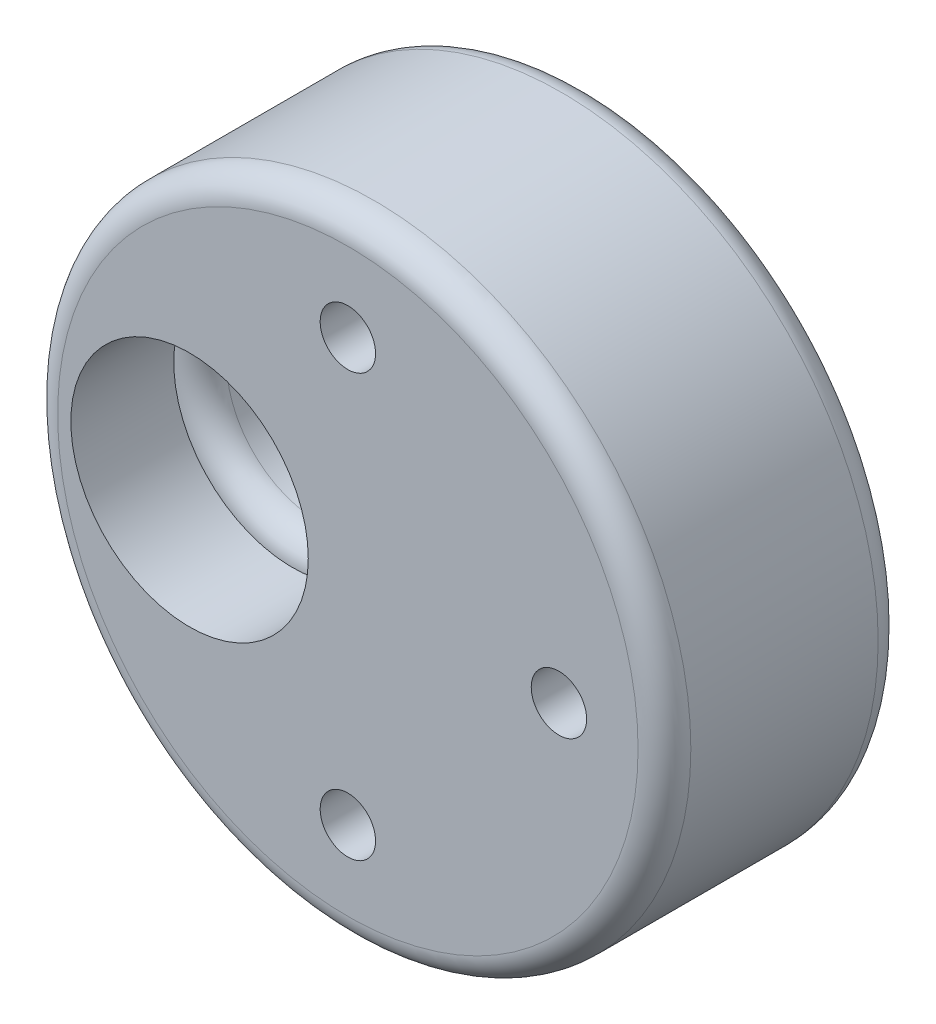
ISO-10303-21;
HEADER;
FILE_DESCRIPTION(('STEP AP214'),'2;1');
FILE_NAME('part.step','',(''),(''),'','','');
FILE_SCHEMA(('AUTOMOTIVE_DESIGN { 1 0 10303 214 1 1 1 1 }'));
ENDSEC;
DATA;
#1=APPLICATION_CONTEXT('core data for automotive mechanical design processes');
#2=APPLICATION_PROTOCOL_DEFINITION('international standard','automotive_design',2000,#1);
#3=PRODUCT_CONTEXT('',#1,'mechanical');
#4=PRODUCT('Part','Part','',(#3));
#5=PRODUCT_RELATED_PRODUCT_CATEGORY('part','',(#4));
#6=PRODUCT_DEFINITION_FORMATION('','',#4);
#7=PRODUCT_DEFINITION_CONTEXT('part definition',#1,'design');
#8=PRODUCT_DEFINITION('design','',#6,#7);
#9=PRODUCT_DEFINITION_SHAPE('','',#8);
#10=(LENGTH_UNIT() NAMED_UNIT(*) SI_UNIT(.MILLI.,.METRE.));
#11=(NAMED_UNIT(*) PLANE_ANGLE_UNIT() SI_UNIT($,.RADIAN.));
#12=(NAMED_UNIT(*) SI_UNIT($,.STERADIAN.) SOLID_ANGLE_UNIT());
#13=UNCERTAINTY_MEASURE_WITH_UNIT(LENGTH_MEASURE(1.E-05),#10,'distance_accuracy_value','');
#14=(GEOMETRIC_REPRESENTATION_CONTEXT(3) GLOBAL_UNCERTAINTY_ASSIGNED_CONTEXT((#13)) GLOBAL_UNIT_ASSIGNED_CONTEXT((#10,
#11,#12)) REPRESENTATION_CONTEXT('',''));
#15=CARTESIAN_POINT('',(0.,0.,0.));
#16=DIRECTION('',(0.,0.,1.));
#17=DIRECTION('',(1.,0.,0.));
#18=AXIS2_PLACEMENT_3D('',#15,#16,#17);
#19=CARTESIAN_POINT('',(8.00000000000028,1.62077717745761E-13,9.1));
#20=DIRECTION('',(0.,0.,-1.));
#21=DIRECTION('',(-1.,0.,0.));
#22=AXIS2_PLACEMENT_3D('',#19,#20,#21);
#23=CYLINDRICAL_SURFACE('',#22,1.0500000000001);
#24=CARTESIAN_POINT('',(8.00000000000028,1.62077717745761E-13,9.1));
#25=DIRECTION('',(0.,0.,1.));
#26=DIRECTION('',(1.,0.,0.));
#27=AXIS2_PLACEMENT_3D('',#24,#25,#26);
#28=CIRCLE('',#27,1.0500000000001);
#29=CARTESIAN_POINT('',(9.05000000000038,1.62077717745761E-13,9.1));
#30=VERTEX_POINT('',#29);
#31=EDGE_CURVE('E77',#30,#30,#28,.T.);
#32=ORIENTED_EDGE('',*,*,#31,.T.);
#33=EDGE_LOOP('',(#32));
#34=FACE_BOUND('',#33,.T.);
#35=CARTESIAN_POINT('',(8.00000000000028,1.62077717745761E-13,6.2));
#36=DIRECTION('',(0.,0.,-1.));
#37=DIRECTION('',(-1.,0.,0.));
#38=AXIS2_PLACEMENT_3D('',#35,#36,#37);
#39=CIRCLE('',#38,1.0500000000001);
#40=CARTESIAN_POINT('',(6.95000000000018,1.62077717745761E-13,6.2));
#41=VERTEX_POINT('',#40);
#42=EDGE_CURVE('E60',#41,#41,#39,.T.);
#43=ORIENTED_EDGE('',*,*,#42,.T.);
#44=EDGE_LOOP('',(#43));
#45=FACE_BOUND('',#44,.T.);
#46=ADVANCED_FACE('F30',(#34,#45),#23,.F.);
#47=CARTESIAN_POINT('',(3.24155435491522E-13,-8.,9.1));
#48=DIRECTION('',(0.,0.,-1.));
#49=DIRECTION('',(-1.,0.,0.));
#50=AXIS2_PLACEMENT_3D('',#47,#48,#49);
#51=CYLINDRICAL_SURFACE('',#50,1.05000000000036);
#52=CARTESIAN_POINT('',(3.24155435491522E-13,-8.,9.1));
#53=DIRECTION('',(0.,0.,1.));
#54=DIRECTION('',(1.,0.,0.));
#55=AXIS2_PLACEMENT_3D('',#52,#53,#54);
#56=CIRCLE('',#55,1.05000000000036);
#57=CARTESIAN_POINT('',(1.05000000000069,-8.,9.1));
#58=VERTEX_POINT('',#57);
#59=EDGE_CURVE('E80',#58,#58,#56,.T.);
#60=ORIENTED_EDGE('',*,*,#59,.T.);
#61=EDGE_LOOP('',(#60));
#62=FACE_BOUND('',#61,.T.);
#63=CARTESIAN_POINT('',(3.24155435491522E-13,-8.,6.2));
#64=DIRECTION('',(0.,0.,-1.));
#65=DIRECTION('',(-1.,0.,0.));
#66=AXIS2_PLACEMENT_3D('',#63,#64,#65);
#67=CIRCLE('',#66,1.05000000000036);
#68=CARTESIAN_POINT('',(-1.05000000000004,-8.,6.2));
#69=VERTEX_POINT('',#68);
#70=EDGE_CURVE('E65',#69,#69,#67,.T.);
#71=ORIENTED_EDGE('',*,*,#70,.T.);
#72=EDGE_LOOP('',(#71));
#73=FACE_BOUND('',#72,.T.);
#74=ADVANCED_FACE('F139',(#62,#73),#51,.F.);
#75=CARTESIAN_POINT('',(0.,8.,9.1));
#76=DIRECTION('',(0.,0.,-1.));
#77=DIRECTION('',(-1.,0.,0.));
#78=AXIS2_PLACEMENT_3D('',#75,#76,#77);
#79=CYLINDRICAL_SURFACE('',#78,1.05);
#80=CARTESIAN_POINT('',(0.,8.,9.1));
#81=DIRECTION('',(0.,0.,1.));
#82=DIRECTION('',(1.,0.,0.));
#83=AXIS2_PLACEMENT_3D('',#80,#81,#82);
#84=CIRCLE('',#83,1.05);
#85=CARTESIAN_POINT('',(1.05,8.,9.1));
#86=VERTEX_POINT('',#85);
#87=EDGE_CURVE('E59',#86,#86,#84,.T.);
#88=ORIENTED_EDGE('',*,*,#87,.T.);
#89=EDGE_LOOP('',(#88));
#90=FACE_BOUND('',#89,.T.);
#91=CARTESIAN_POINT('',(0.,8.,6.2));
#92=DIRECTION('',(0.,0.,-1.));
#93=DIRECTION('',(-1.,0.,0.));
#94=AXIS2_PLACEMENT_3D('',#91,#92,#93);
#95=CIRCLE('',#94,1.05);
#96=CARTESIAN_POINT('',(-1.05,8.,6.2));
#97=VERTEX_POINT('',#96);
#98=EDGE_CURVE('E70',#97,#97,#95,.T.);
#99=ORIENTED_EDGE('',*,*,#98,.T.);
#100=EDGE_LOOP('',(#99));
#101=FACE_BOUND('',#100,.T.);
#102=ADVANCED_FACE('F145',(#90,#101),#79,.F.);
#103=CARTESIAN_POINT('',(0.,0.,9.1));
#104=DIRECTION('',(0.,0.,1.));
#105=DIRECTION('',(1.,0.,0.));
#106=AXIS2_PLACEMENT_3D('',#103,#104,#105);
#107=PLANE('',#106);
#108=CARTESIAN_POINT('',(0.,0.,9.1));
#109=DIRECTION('',(0.,0.,1.));
#110=DIRECTION('',(1.,0.,0.));
#111=AXIS2_PLACEMENT_3D('',#108,#109,#110);
#112=CIRCLE('',#111,11.);
#113=CARTESIAN_POINT('',(11.,0.,9.1));
#114=VERTEX_POINT('',#113);
#115=EDGE_CURVE('E50',#114,#114,#112,.T.);
#116=ORIENTED_EDGE('',*,*,#115,.T.);
#117=EDGE_LOOP('',(#116));
#118=FACE_BOUND('',#117,.T.);
#119=CARTESIAN_POINT('',(-6.,0.,9.1));
#120=DIRECTION('',(0.,0.,1.));
#121=DIRECTION('',(1.,0.,0.));
#122=AXIS2_PLACEMENT_3D('',#119,#120,#121);
#123=CIRCLE('',#122,4.50000000000001);
#124=CARTESIAN_POINT('',(-1.49999999999999,0.,9.1));
#125=VERTEX_POINT('',#124);
#126=EDGE_CURVE('E73',#125,#125,#123,.T.);
#127=ORIENTED_EDGE('',*,*,#126,.F.);
#128=EDGE_LOOP('',(#127));
#129=FACE_BOUND('',#128,.T.);
#130=ORIENTED_EDGE('',*,*,#31,.F.);
#131=EDGE_LOOP('',(#130));
#132=FACE_BOUND('',#131,.T.);
#133=ORIENTED_EDGE('',*,*,#87,.F.);
#134=EDGE_LOOP('',(#133));
#135=FACE_BOUND('',#134,.T.);
#136=ORIENTED_EDGE('',*,*,#59,.F.);
#137=EDGE_LOOP('',(#136));
#138=FACE_BOUND('',#137,.T.);
#139=ADVANCED_FACE('F115',(#118,#129,#132,#135,#138),#107,.T.);
#140=CARTESIAN_POINT('',(0.,0.,0.));
#141=DIRECTION('',(0.,0.,1.));
#142=DIRECTION('',(1.,0.,0.));
#143=AXIS2_PLACEMENT_3D('',#140,#141,#142);
#144=PLANE('',#143);
#145=CARTESIAN_POINT('',(0.,0.,0.));
#146=DIRECTION('',(0.,0.,1.));
#147=DIRECTION('',(1.,0.,0.));
#148=AXIS2_PLACEMENT_3D('',#145,#146,#147);
#149=CIRCLE('',#148,11.);
#150=CARTESIAN_POINT('',(11.,0.,0.));
#151=VERTEX_POINT('',#150);
#152=EDGE_CURVE('E10',#151,#151,#149,.F.);
#153=ORIENTED_EDGE('',*,*,#152,.T.);
#154=EDGE_LOOP('',(#153));
#155=FACE_BOUND('',#154,.T.);
#156=CARTESIAN_POINT('',(-6.,0.,0.));
#157=DIRECTION('',(0.,0.,1.));
#158=DIRECTION('',(1.,0.,0.));
#159=AXIS2_PLACEMENT_3D('',#156,#157,#158);
#160=CIRCLE('',#159,4.50000000000001);
#161=CARTESIAN_POINT('',(-1.49999999999999,0.,0.));
#162=VERTEX_POINT('',#161);
#163=EDGE_CURVE('E37',#162,#162,#160,.T.);
#164=ORIENTED_EDGE('',*,*,#163,.T.);
#165=EDGE_LOOP('',(#164));
#166=FACE_BOUND('',#165,.T.);
#167=CARTESIAN_POINT('',(8.00000000000028,1.62077717745761E-13,0.));
#168=DIRECTION('',(0.,0.,-1.));
#169=DIRECTION('',(-1.,0.,0.));
#170=AXIS2_PLACEMENT_3D('',#167,#168,#169);
#171=CIRCLE('',#170,2.15);
#172=CARTESIAN_POINT('',(5.85000000000028,1.62077717745761E-13,0.));
#173=VERTEX_POINT('',#172);
#174=EDGE_CURVE('E96',#173,#173,#171,.T.);
#175=ORIENTED_EDGE('',*,*,#174,.F.);
#176=EDGE_LOOP('',(#175));
#177=FACE_BOUND('',#176,.T.);
#178=CARTESIAN_POINT('',(3.24155435491522E-13,-8.,0.));
#179=DIRECTION('',(0.,0.,-1.));
#180=DIRECTION('',(-1.,0.,0.));
#181=AXIS2_PLACEMENT_3D('',#178,#179,#180);
#182=CIRCLE('',#181,2.15);
#183=CARTESIAN_POINT('',(-2.14999999999968,-8.,0.));
#184=VERTEX_POINT('',#183);
#185=EDGE_CURVE('E63',#184,#184,#182,.T.);
#186=ORIENTED_EDGE('',*,*,#185,.F.);
#187=EDGE_LOOP('',(#186));
#188=FACE_BOUND('',#187,.T.);
#189=CARTESIAN_POINT('',(0.,8.,0.));
#190=DIRECTION('',(0.,0.,-1.));
#191=DIRECTION('',(-1.,0.,0.));
#192=AXIS2_PLACEMENT_3D('',#189,#190,#191);
#193=CIRCLE('',#192,2.15);
#194=CARTESIAN_POINT('',(-2.15,8.,0.));
#195=VERTEX_POINT('',#194);
#196=EDGE_CURVE('E68',#195,#195,#193,.T.);
#197=ORIENTED_EDGE('',*,*,#196,.F.);
#198=EDGE_LOOP('',(#197));
#199=FACE_BOUND('',#198,.T.);
#200=ADVANCED_FACE('F111',(#155,#166,#177,#188,#199),#144,.F.);
#201=CARTESIAN_POINT('',(0.,0.,9.1));
#202=DIRECTION('',(0.,0.,-1.));
#203=DIRECTION('',(-1.,0.,0.));
#204=AXIS2_PLACEMENT_3D('',#201,#202,#203);
#205=CYLINDRICAL_SURFACE('',#204,12.);
#206=CARTESIAN_POINT('',(0.,0.,8.1));
#207=DIRECTION('',(0.,0.,1.));
#208=DIRECTION('',(1.,0.,0.));
#209=AXIS2_PLACEMENT_3D('',#206,#207,#208);
#210=CIRCLE('',#209,12.);
#211=CARTESIAN_POINT('',(12.,0.,8.1));
#212=VERTEX_POINT('',#211);
#213=EDGE_CURVE('E41',#212,#212,#210,.F.);
#214=ORIENTED_EDGE('',*,*,#213,.T.);
#215=EDGE_LOOP('',(#214));
#216=FACE_BOUND('',#215,.T.);
#217=CARTESIAN_POINT('',(0.,0.,1.));
#218=DIRECTION('',(0.,0.,1.));
#219=DIRECTION('',(1.,0.,0.));
#220=AXIS2_PLACEMENT_3D('',#217,#218,#219);
#221=CIRCLE('',#220,12.);
#222=CARTESIAN_POINT('',(12.,0.,1.));
#223=VERTEX_POINT('',#222);
#224=EDGE_CURVE('E45',#223,#223,#221,.T.);
#225=ORIENTED_EDGE('',*,*,#224,.T.);
#226=EDGE_LOOP('',(#225));
#227=FACE_BOUND('',#226,.T.);
#228=ADVANCED_FACE('F114',(#216,#227),#205,.T.);
#229=CARTESIAN_POINT('',(-6.,0.,9.1));
#230=DIRECTION('',(0.,0.,1.));
#231=DIRECTION('',(1.,0.,0.));
#232=AXIS2_PLACEMENT_3D('',#229,#230,#231);
#233=CYLINDRICAL_SURFACE('',#232,3.50000000000001);
#234=CARTESIAN_POINT('',(-6.,0.,4.2));
#235=DIRECTION('',(0.,0.,-1.));
#236=DIRECTION('',(-1.,0.,0.));
#237=AXIS2_PLACEMENT_3D('',#234,#235,#236);
#238=CIRCLE('',#237,3.50000000000001);
#239=CARTESIAN_POINT('',(-9.50000000000001,0.,4.2));
#240=VERTEX_POINT('',#239);
#241=EDGE_CURVE('E53',#240,#240,#238,.F.);
#242=ORIENTED_EDGE('',*,*,#241,.T.);
#243=EDGE_LOOP('',(#242));
#244=FACE_BOUND('',#243,.T.);
#245=CARTESIAN_POINT('',(-6.,0.,1.));
#246=DIRECTION('',(0.,0.,1.));
#247=DIRECTION('',(1.,0.,0.));
#248=AXIS2_PLACEMENT_3D('',#245,#246,#247);
#249=CIRCLE('',#248,3.50000000000001);
#250=CARTESIAN_POINT('',(-2.49999999999999,0.,1.));
#251=VERTEX_POINT('',#250);
#252=EDGE_CURVE('E56',#251,#251,#249,.F.);
#253=ORIENTED_EDGE('',*,*,#252,.T.);
#254=EDGE_LOOP('',(#253));
#255=FACE_BOUND('',#254,.T.);
#256=ADVANCED_FACE('F134',(#244,#255),#233,.F.);
#257=CARTESIAN_POINT('',(-6.,0.,9.1));
#258=DIRECTION('',(0.,0.,1.));
#259=DIRECTION('',(1.,0.,0.));
#260=AXIS2_PLACEMENT_3D('',#257,#258,#259);
#261=CYLINDRICAL_SURFACE('',#260,4.50000000000001);
#262=CARTESIAN_POINT('',(-6.,0.,5.2));
#263=DIRECTION('',(0.,0.,1.));
#264=DIRECTION('',(1.,0.,0.));
#265=AXIS2_PLACEMENT_3D('',#262,#263,#264);
#266=CIRCLE('',#265,4.50000000000001);
#267=CARTESIAN_POINT('',(-1.49999999999999,0.,5.2));
#268=VERTEX_POINT('',#267);
#269=EDGE_CURVE('E83',#268,#268,#266,.T.);
#270=ORIENTED_EDGE('',*,*,#269,.F.);
#271=EDGE_LOOP('',(#270));
#272=FACE_BOUND('',#271,.T.);
#273=ORIENTED_EDGE('',*,*,#126,.T.);
#274=EDGE_LOOP('',(#273));
#275=FACE_BOUND('',#274,.T.);
#276=ADVANCED_FACE('F124',(#272,#275),#261,.F.);
#277=CARTESIAN_POINT('',(0.,8.,6.2));
#278=DIRECTION('',(0.,0.,-1.));
#279=DIRECTION('',(-1.,0.,0.));
#280=AXIS2_PLACEMENT_3D('',#277,#278,#279);
#281=CYLINDRICAL_SURFACE('',#280,2.15);
#282=CARTESIAN_POINT('',(0.,8.,6.2));
#283=DIRECTION('',(0.,0.,-1.));
#284=DIRECTION('',(-1.,0.,0.));
#285=AXIS2_PLACEMENT_3D('',#282,#283,#284);
#286=CIRCLE('',#285,2.15);
#287=CARTESIAN_POINT('',(-2.15,8.,6.2));
#288=VERTEX_POINT('',#287);
#289=EDGE_CURVE('E74',#288,#288,#286,.T.);
#290=CARTESIAN_POINT('',(-2.15,8.,6.2));
#291=CARTESIAN_POINT('',(-2.15,8.,6.13541666666667));
#292=CARTESIAN_POINT('',(-2.15,8.,6.07083333333333));
#293=CARTESIAN_POINT('',(-2.15,8.,5.94166666666667));
#294=CARTESIAN_POINT('',(-2.15,8.,5.87708333333333));
#295=CARTESIAN_POINT('',(-2.15,8.,5.74791666666667));
#296=CARTESIAN_POINT('',(-2.15,8.,5.68333333333333));
#297=CARTESIAN_POINT('',(-2.15,8.,5.55416666666667));
#298=CARTESIAN_POINT('',(-2.15,8.,5.48958333333333));
#299=CARTESIAN_POINT('',(-2.15,8.,5.36041666666667));
#300=CARTESIAN_POINT('',(-2.15,8.,5.29583333333333));
#301=CARTESIAN_POINT('',(-2.15,8.,5.16666666666667));
#302=CARTESIAN_POINT('',(-2.15,8.,5.10208333333333));
#303=CARTESIAN_POINT('',(-2.15,8.,4.97291666666667));
#304=CARTESIAN_POINT('',(-2.15,8.,4.90833333333333));
#305=CARTESIAN_POINT('',(-2.15,8.,4.77916666666667));
#306=CARTESIAN_POINT('',(-2.15,8.,4.71458333333333));
#307=CARTESIAN_POINT('',(-2.15,8.,4.58541666666667));
#308=CARTESIAN_POINT('',(-2.15,8.,4.52083333333333));
#309=CARTESIAN_POINT('',(-2.15,8.,4.39166666666667));
#310=CARTESIAN_POINT('',(-2.15,8.,4.32708333333333));
#311=CARTESIAN_POINT('',(-2.15,8.,4.19791666666667));
#312=CARTESIAN_POINT('',(-2.15,8.,4.13333333333333));
#313=CARTESIAN_POINT('',(-2.15,8.,4.00416666666667));
#314=CARTESIAN_POINT('',(-2.15,8.,3.93958333333333));
#315=CARTESIAN_POINT('',(-2.15,8.,3.81041666666667));
#316=CARTESIAN_POINT('',(-2.15,8.,3.74583333333333));
#317=CARTESIAN_POINT('',(-2.15,8.,3.61666666666667));
#318=CARTESIAN_POINT('',(-2.15,8.,3.55208333333333));
#319=CARTESIAN_POINT('',(-2.15,8.,3.42291666666667));
#320=CARTESIAN_POINT('',(-2.15,8.,3.35833333333333));
#321=CARTESIAN_POINT('',(-2.15,8.,3.22916666666667));
#322=CARTESIAN_POINT('',(-2.15,8.,3.16458333333333));
#323=CARTESIAN_POINT('',(-2.15,8.,3.03541666666667));
#324=CARTESIAN_POINT('',(-2.15,8.,2.97083333333333));
#325=CARTESIAN_POINT('',(-2.15,8.,2.84166666666667));
#326=CARTESIAN_POINT('',(-2.15,8.,2.77708333333333));
#327=CARTESIAN_POINT('',(-2.15,8.,2.64791666666667));
#328=CARTESIAN_POINT('',(-2.15,8.,2.58333333333333));
#329=CARTESIAN_POINT('',(-2.15,8.,2.45416666666667));
#330=CARTESIAN_POINT('',(-2.15,8.,2.38958333333333));
#331=CARTESIAN_POINT('',(-2.15,8.,2.26041666666667));
#332=CARTESIAN_POINT('',(-2.15,8.,2.19583333333333));
#333=CARTESIAN_POINT('',(-2.15,8.,2.06666666666667));
#334=CARTESIAN_POINT('',(-2.15,8.,2.00208333333333));
#335=CARTESIAN_POINT('',(-2.15,8.,1.87291666666667));
#336=CARTESIAN_POINT('',(-2.15,8.,1.80833333333333));
#337=CARTESIAN_POINT('',(-2.15,8.,1.67916666666667));
#338=CARTESIAN_POINT('',(-2.15,8.,1.61458333333333));
#339=CARTESIAN_POINT('',(-2.15,8.,1.48541666666667));
#340=CARTESIAN_POINT('',(-2.15,8.,1.42083333333333));
#341=CARTESIAN_POINT('',(-2.15,8.,1.29166666666667));
#342=CARTESIAN_POINT('',(-2.15,8.,1.22708333333333));
#343=CARTESIAN_POINT('',(-2.15,8.,1.09791666666667));
#344=CARTESIAN_POINT('',(-2.15,8.,1.03333333333333));
#345=CARTESIAN_POINT('',(-2.15,8.,0.904166666666667));
#346=CARTESIAN_POINT('',(-2.15,8.,0.839583333333333));
#347=CARTESIAN_POINT('',(-2.15,8.,0.710416666666666));
#348=CARTESIAN_POINT('',(-2.15,8.,0.645833333333333));
#349=CARTESIAN_POINT('',(-2.15,8.,0.516666666666667));
#350=CARTESIAN_POINT('',(-2.15,8.,0.452083333333333));
#351=CARTESIAN_POINT('',(-2.15,8.,0.322916666666667));
#352=CARTESIAN_POINT('',(-2.15,8.,0.258333333333334));
#353=CARTESIAN_POINT('',(-2.15,8.,0.129166666666667));
#354=CARTESIAN_POINT('',(-2.15,8.,0.0645833333333335));
#355=CARTESIAN_POINT('',(-2.15,8.,0.));
#356=B_SPLINE_CURVE_WITH_KNOTS('',3,(#290,#291,#292,#293,#294,#295,#296,#297,#298,#299,#300,
#301,#302,#303,#304,#305,#306,#307,#308,#309,#310,#311,#312,#313,#314,#315,#316,#317,#318,#319,
#320,#321,#322,#323,#324,#325,#326,#327,#328,#329,#330,#331,#332,#333,#334,#335,#336,#337,#338,
#339,#340,#341,#342,#343,#344,#345,#346,#347,#348,#349,#350,#351,#352,#353,#354,#355),
.UNSPECIFIED.,.F.,.F.,(4,2,2,2,2,2,2,2,2,2,2,2,2,2,2,2,2,2,2,2,2,2,2,2,2,2,2,2,2,2,2,2,4),(0.,
0.193749999999999,0.3875,0.581249999999999,0.775,0.96875,1.1625,1.35625,1.55,1.74375,1.9375,
2.13125,2.325,2.51875,2.7125,2.90625,3.1,3.29375,3.4875,3.68125,3.875,4.06875,4.2625,4.45625,
4.65,4.84375,5.0375,5.23125,5.425,5.61875,5.8125,6.00625,6.2),.UNSPECIFIED.);
#357=EDGE_CURVE('BSEAM121',#288,#195,#356,.T.);
#358=ORIENTED_EDGE('',*,*,#289,.F.);
#359=ORIENTED_EDGE('',*,*,#196,.T.);
#360=ORIENTED_EDGE('',*,*,#357,.T.);
#361=ORIENTED_EDGE('',*,*,#357,.F.);
#362=EDGE_LOOP('',(#358,#360,#359,#361));
#363=FACE_BOUND('',#362,.T.);
#364=ADVANCED_FACE('F121',(#363),#281,.F.);
#365=CARTESIAN_POINT('',(0.,8.,6.2));
#366=DIRECTION('',(0.,0.,-1.));
#367=DIRECTION('',(-1.,0.,0.));
#368=AXIS2_PLACEMENT_3D('',#365,#366,#367);
#369=PLANE('',#368);
#370=ORIENTED_EDGE('',*,*,#98,.F.);
#371=EDGE_LOOP('',(#370));
#372=FACE_BOUND('',#371,.T.);
#373=ORIENTED_EDGE('',*,*,#289,.T.);
#374=EDGE_LOOP('',(#373));
#375=FACE_BOUND('',#374,.T.);
#376=ADVANCED_FACE('F123',(#372,#375),#369,.T.);
#377=CARTESIAN_POINT('',(3.24155435491522E-13,-8.,6.2));
#378=DIRECTION('',(0.,0.,-1.));
#379=DIRECTION('',(-1.,0.,0.));
#380=AXIS2_PLACEMENT_3D('',#377,#378,#379);
#381=CYLINDRICAL_SURFACE('',#380,2.15);
#382=CARTESIAN_POINT('',(3.24155435491522E-13,-8.,6.2));
#383=DIRECTION('',(0.,0.,-1.));
#384=DIRECTION('',(-1.,0.,0.));
#385=AXIS2_PLACEMENT_3D('',#382,#383,#384);
#386=CIRCLE('',#385,2.15);
#387=CARTESIAN_POINT('',(-2.14999999999968,-8.,6.2));
#388=VERTEX_POINT('',#387);
#389=EDGE_CURVE('E69',#388,#388,#386,.T.);
#390=CARTESIAN_POINT('',(-2.14999999999968,-8.,6.2));
#391=CARTESIAN_POINT('',(-2.14999999999968,-8.,6.13541666666667));
#392=CARTESIAN_POINT('',(-2.14999999999968,-8.,6.07083333333333));
#393=CARTESIAN_POINT('',(-2.14999999999968,-8.,5.94166666666667));
#394=CARTESIAN_POINT('',(-2.14999999999968,-8.,5.87708333333333));
#395=CARTESIAN_POINT('',(-2.14999999999968,-8.,5.74791666666667));
#396=CARTESIAN_POINT('',(-2.14999999999968,-8.,5.68333333333333));
#397=CARTESIAN_POINT('',(-2.14999999999968,-8.,5.55416666666667));
#398=CARTESIAN_POINT('',(-2.14999999999968,-8.,5.48958333333333));
#399=CARTESIAN_POINT('',(-2.14999999999968,-8.,5.36041666666667));
#400=CARTESIAN_POINT('',(-2.14999999999968,-8.,5.29583333333333));
#401=CARTESIAN_POINT('',(-2.14999999999968,-8.,5.16666666666667));
#402=CARTESIAN_POINT('',(-2.14999999999968,-8.,5.10208333333333));
#403=CARTESIAN_POINT('',(-2.14999999999968,-8.,4.97291666666667));
#404=CARTESIAN_POINT('',(-2.14999999999968,-8.,4.90833333333333));
#405=CARTESIAN_POINT('',(-2.14999999999968,-8.,4.77916666666667));
#406=CARTESIAN_POINT('',(-2.14999999999968,-8.,4.71458333333333));
#407=CARTESIAN_POINT('',(-2.14999999999968,-8.,4.58541666666667));
#408=CARTESIAN_POINT('',(-2.14999999999968,-8.,4.52083333333333));
#409=CARTESIAN_POINT('',(-2.14999999999968,-8.,4.39166666666667));
#410=CARTESIAN_POINT('',(-2.14999999999968,-8.,4.32708333333333));
#411=CARTESIAN_POINT('',(-2.14999999999968,-8.,4.19791666666667));
#412=CARTESIAN_POINT('',(-2.14999999999968,-8.,4.13333333333333));
#413=CARTESIAN_POINT('',(-2.14999999999968,-8.,4.00416666666667));
#414=CARTESIAN_POINT('',(-2.14999999999968,-8.,3.93958333333333));
#415=CARTESIAN_POINT('',(-2.14999999999968,-8.,3.81041666666667));
#416=CARTESIAN_POINT('',(-2.14999999999968,-8.,3.74583333333333));
#417=CARTESIAN_POINT('',(-2.14999999999968,-8.,3.61666666666667));
#418=CARTESIAN_POINT('',(-2.14999999999968,-8.,3.55208333333333));
#419=CARTESIAN_POINT('',(-2.14999999999968,-8.,3.42291666666667));
#420=CARTESIAN_POINT('',(-2.14999999999968,-8.,3.35833333333333));
#421=CARTESIAN_POINT('',(-2.14999999999968,-8.,3.22916666666667));
#422=CARTESIAN_POINT('',(-2.14999999999968,-8.,3.16458333333333));
#423=CARTESIAN_POINT('',(-2.14999999999968,-8.,3.03541666666667));
#424=CARTESIAN_POINT('',(-2.14999999999968,-8.,2.97083333333333));
#425=CARTESIAN_POINT('',(-2.14999999999968,-8.,2.84166666666667));
#426=CARTESIAN_POINT('',(-2.14999999999968,-8.,2.77708333333333));
#427=CARTESIAN_POINT('',(-2.14999999999968,-8.,2.64791666666667));
#428=CARTESIAN_POINT('',(-2.14999999999968,-8.,2.58333333333333));
#429=CARTESIAN_POINT('',(-2.14999999999968,-8.,2.45416666666667));
#430=CARTESIAN_POINT('',(-2.14999999999968,-8.,2.38958333333333));
#431=CARTESIAN_POINT('',(-2.14999999999968,-8.,2.26041666666667));
#432=CARTESIAN_POINT('',(-2.14999999999968,-8.,2.19583333333333));
#433=CARTESIAN_POINT('',(-2.14999999999968,-8.,2.06666666666667));
#434=CARTESIAN_POINT('',(-2.14999999999968,-8.,2.00208333333333));
#435=CARTESIAN_POINT('',(-2.14999999999968,-8.,1.87291666666667));
#436=CARTESIAN_POINT('',(-2.14999999999968,-8.,1.80833333333333));
#437=CARTESIAN_POINT('',(-2.14999999999968,-8.,1.67916666666667));
#438=CARTESIAN_POINT('',(-2.14999999999968,-8.,1.61458333333333));
#439=CARTESIAN_POINT('',(-2.14999999999968,-8.,1.48541666666667));
#440=CARTESIAN_POINT('',(-2.14999999999968,-8.,1.42083333333333));
#441=CARTESIAN_POINT('',(-2.14999999999968,-8.,1.29166666666667));
#442=CARTESIAN_POINT('',(-2.14999999999968,-8.,1.22708333333333));
#443=CARTESIAN_POINT('',(-2.14999999999968,-8.,1.09791666666667));
#444=CARTESIAN_POINT('',(-2.14999999999968,-8.,1.03333333333333));
#445=CARTESIAN_POINT('',(-2.14999999999968,-8.,0.904166666666667));
#446=CARTESIAN_POINT('',(-2.14999999999968,-8.,0.839583333333333));
#447=CARTESIAN_POINT('',(-2.14999999999968,-8.,0.710416666666666));
#448=CARTESIAN_POINT('',(-2.14999999999968,-8.,0.645833333333333));
#449=CARTESIAN_POINT('',(-2.14999999999968,-8.,0.516666666666667));
#450=CARTESIAN_POINT('',(-2.14999999999968,-8.,0.452083333333333));
#451=CARTESIAN_POINT('',(-2.14999999999968,-8.,0.322916666666667));
#452=CARTESIAN_POINT('',(-2.14999999999968,-8.,0.258333333333334));
#453=CARTESIAN_POINT('',(-2.14999999999968,-8.,0.129166666666667));
#454=CARTESIAN_POINT('',(-2.14999999999968,-8.,0.0645833333333335));
#455=CARTESIAN_POINT('',(-2.14999999999968,-8.,0.));
#456=B_SPLINE_CURVE_WITH_KNOTS('',3,(#390,#391,#392,#393,#394,#395,#396,#397,#398,#399,#400,
#401,#402,#403,#404,#405,#406,#407,#408,#409,#410,#411,#412,#413,#414,#415,#416,#417,#418,#419,
#420,#421,#422,#423,#424,#425,#426,#427,#428,#429,#430,#431,#432,#433,#434,#435,#436,#437,#438,
#439,#440,#441,#442,#443,#444,#445,#446,#447,#448,#449,#450,#451,#452,#453,#454,#455),
.UNSPECIFIED.,.F.,.F.,(4,2,2,2,2,2,2,2,2,2,2,2,2,2,2,2,2,2,2,2,2,2,2,2,2,2,2,2,2,2,2,2,4),(0.,
0.193749999999999,0.3875,0.581249999999999,0.775,0.96875,1.1625,1.35625,1.55,1.74375,1.9375,
2.13125,2.325,2.51875,2.7125,2.90625,3.1,3.29375,3.4875,3.68125,3.875,4.06875,4.2625,4.45625,
4.65,4.84375,5.0375,5.23125,5.425,5.61875,5.8125,6.00625,6.2),.UNSPECIFIED.);
#457=EDGE_CURVE('BSEAM131',#388,#184,#456,.T.);
#458=ORIENTED_EDGE('',*,*,#389,.F.);
#459=ORIENTED_EDGE('',*,*,#185,.T.);
#460=ORIENTED_EDGE('',*,*,#457,.T.);
#461=ORIENTED_EDGE('',*,*,#457,.F.);
#462=EDGE_LOOP('',(#458,#460,#459,#461));
#463=FACE_BOUND('',#462,.T.);
#464=ADVANCED_FACE('F131',(#463),#381,.F.);
#465=CARTESIAN_POINT('',(3.24155435491522E-13,-8.,6.2));
#466=DIRECTION('',(0.,0.,-1.));
#467=DIRECTION('',(-1.,0.,0.));
#468=AXIS2_PLACEMENT_3D('',#465,#466,#467);
#469=PLANE('',#468);
#470=ORIENTED_EDGE('',*,*,#70,.F.);
#471=EDGE_LOOP('',(#470));
#472=FACE_BOUND('',#471,.T.);
#473=ORIENTED_EDGE('',*,*,#389,.T.);
#474=EDGE_LOOP('',(#473));
#475=FACE_BOUND('',#474,.T.);
#476=ADVANCED_FACE('F107',(#472,#475),#469,.T.);
#477=CARTESIAN_POINT('',(8.00000000000028,1.62077717745761E-13,6.2));
#478=DIRECTION('',(0.,0.,-1.));
#479=DIRECTION('',(-1.,0.,0.));
#480=AXIS2_PLACEMENT_3D('',#477,#478,#479);
#481=CYLINDRICAL_SURFACE('',#480,2.15);
#482=CARTESIAN_POINT('',(8.00000000000028,1.62077717745761E-13,6.2));
#483=DIRECTION('',(0.,0.,-1.));
#484=DIRECTION('',(-1.,0.,0.));
#485=AXIS2_PLACEMENT_3D('',#482,#483,#484);
#486=CIRCLE('',#485,2.15);
#487=CARTESIAN_POINT('',(5.85000000000028,1.62077717745761E-13,6.2));
#488=VERTEX_POINT('',#487);
#489=EDGE_CURVE('E64',#488,#488,#486,.T.);
#490=CARTESIAN_POINT('',(5.85000000000028,1.62077717745761E-13,6.2));
#491=CARTESIAN_POINT('',(5.85000000000028,1.62077717745761E-13,6.13541666666667));
#492=CARTESIAN_POINT('',(5.85000000000028,1.62077717745761E-13,6.07083333333333));
#493=CARTESIAN_POINT('',(5.85000000000028,1.62077717745761E-13,5.94166666666667));
#494=CARTESIAN_POINT('',(5.85000000000028,1.62077717745761E-13,5.87708333333333));
#495=CARTESIAN_POINT('',(5.85000000000028,1.62077717745761E-13,5.74791666666667));
#496=CARTESIAN_POINT('',(5.85000000000028,1.62077717745761E-13,5.68333333333333));
#497=CARTESIAN_POINT('',(5.85000000000028,1.62077717745761E-13,5.55416666666667));
#498=CARTESIAN_POINT('',(5.85000000000028,1.62077717745761E-13,5.48958333333333));
#499=CARTESIAN_POINT('',(5.85000000000028,1.62077717745761E-13,5.36041666666667));
#500=CARTESIAN_POINT('',(5.85000000000028,1.62077717745761E-13,5.29583333333333));
#501=CARTESIAN_POINT('',(5.85000000000028,1.62077717745761E-13,5.16666666666667));
#502=CARTESIAN_POINT('',(5.85000000000028,1.62077717745761E-13,5.10208333333333));
#503=CARTESIAN_POINT('',(5.85000000000028,1.62077717745761E-13,4.97291666666667));
#504=CARTESIAN_POINT('',(5.85000000000028,1.62077717745761E-13,4.90833333333333));
#505=CARTESIAN_POINT('',(5.85000000000028,1.62077717745761E-13,4.77916666666667));
#506=CARTESIAN_POINT('',(5.85000000000028,1.62077717745761E-13,4.71458333333333));
#507=CARTESIAN_POINT('',(5.85000000000028,1.62077717745761E-13,4.58541666666667));
#508=CARTESIAN_POINT('',(5.85000000000028,1.62077717745761E-13,4.52083333333333));
#509=CARTESIAN_POINT('',(5.85000000000028,1.62077717745761E-13,4.39166666666667));
#510=CARTESIAN_POINT('',(5.85000000000028,1.62077717745761E-13,4.32708333333333));
#511=CARTESIAN_POINT('',(5.85000000000028,1.62077717745761E-13,4.19791666666667));
#512=CARTESIAN_POINT('',(5.85000000000028,1.62077717745761E-13,4.13333333333333));
#513=CARTESIAN_POINT('',(5.85000000000028,1.62077717745761E-13,4.00416666666667));
#514=CARTESIAN_POINT('',(5.85000000000028,1.62077717745761E-13,3.93958333333333));
#515=CARTESIAN_POINT('',(5.85000000000028,1.62077717745761E-13,3.81041666666667));
#516=CARTESIAN_POINT('',(5.85000000000028,1.62077717745761E-13,3.74583333333333));
#517=CARTESIAN_POINT('',(5.85000000000028,1.62077717745761E-13,3.61666666666667));
#518=CARTESIAN_POINT('',(5.85000000000028,1.62077717745761E-13,3.55208333333333));
#519=CARTESIAN_POINT('',(5.85000000000028,1.62077717745761E-13,3.42291666666667));
#520=CARTESIAN_POINT('',(5.85000000000028,1.62077717745761E-13,3.35833333333333));
#521=CARTESIAN_POINT('',(5.85000000000028,1.62077717745761E-13,3.22916666666667));
#522=CARTESIAN_POINT('',(5.85000000000028,1.62077717745761E-13,3.16458333333333));
#523=CARTESIAN_POINT('',(5.85000000000028,1.62077717745761E-13,3.03541666666667));
#524=CARTESIAN_POINT('',(5.85000000000028,1.62077717745761E-13,2.97083333333333));
#525=CARTESIAN_POINT('',(5.85000000000028,1.62077717745761E-13,2.84166666666667));
#526=CARTESIAN_POINT('',(5.85000000000028,1.62077717745761E-13,2.77708333333333));
#527=CARTESIAN_POINT('',(5.85000000000028,1.62077717745761E-13,2.64791666666667));
#528=CARTESIAN_POINT('',(5.85000000000028,1.62077717745761E-13,2.58333333333333));
#529=CARTESIAN_POINT('',(5.85000000000028,1.62077717745761E-13,2.45416666666667));
#530=CARTESIAN_POINT('',(5.85000000000028,1.62077717745761E-13,2.38958333333333));
#531=CARTESIAN_POINT('',(5.85000000000028,1.62077717745761E-13,2.26041666666667));
#532=CARTESIAN_POINT('',(5.85000000000028,1.62077717745761E-13,2.19583333333333));
#533=CARTESIAN_POINT('',(5.85000000000028,1.62077717745761E-13,2.06666666666667));
#534=CARTESIAN_POINT('',(5.85000000000028,1.62077717745761E-13,2.00208333333333));
#535=CARTESIAN_POINT('',(5.85000000000028,1.62077717745761E-13,1.87291666666667));
#536=CARTESIAN_POINT('',(5.85000000000028,1.62077717745761E-13,1.80833333333333));
#537=CARTESIAN_POINT('',(5.85000000000028,1.62077717745761E-13,1.67916666666667));
#538=CARTESIAN_POINT('',(5.85000000000028,1.62077717745761E-13,1.61458333333333));
#539=CARTESIAN_POINT('',(5.85000000000028,1.62077717745761E-13,1.48541666666667));
#540=CARTESIAN_POINT('',(5.85000000000028,1.62077717745761E-13,1.42083333333333));
#541=CARTESIAN_POINT('',(5.85000000000028,1.62077717745761E-13,1.29166666666667));
#542=CARTESIAN_POINT('',(5.85000000000028,1.62077717745761E-13,1.22708333333333));
#543=CARTESIAN_POINT('',(5.85000000000028,1.62077717745761E-13,1.09791666666667));
#544=CARTESIAN_POINT('',(5.85000000000028,1.62077717745761E-13,1.03333333333333));
#545=CARTESIAN_POINT('',(5.85000000000028,1.62077717745761E-13,0.904166666666667));
#546=CARTESIAN_POINT('',(5.85000000000028,1.62077717745761E-13,0.839583333333333));
#547=CARTESIAN_POINT('',(5.85000000000028,1.62077717745761E-13,0.710416666666666));
#548=CARTESIAN_POINT('',(5.85000000000028,1.62077717745761E-13,0.645833333333333));
#549=CARTESIAN_POINT('',(5.85000000000028,1.62077717745761E-13,0.516666666666667));
#550=CARTESIAN_POINT('',(5.85000000000028,1.62077717745761E-13,0.452083333333333));
#551=CARTESIAN_POINT('',(5.85000000000028,1.62077717745761E-13,0.322916666666667));
#552=CARTESIAN_POINT('',(5.85000000000028,1.62077717745761E-13,0.258333333333334));
#553=CARTESIAN_POINT('',(5.85000000000028,1.62077717745761E-13,0.129166666666667));
#554=CARTESIAN_POINT('',(5.85000000000028,1.62077717745761E-13,0.0645833333333335));
#555=CARTESIAN_POINT('',(5.85000000000028,1.62077717745761E-13,0.));
#556=B_SPLINE_CURVE_WITH_KNOTS('',3,(#490,#491,#492,#493,#494,#495,#496,#497,#498,#499,#500,
#501,#502,#503,#504,#505,#506,#507,#508,#509,#510,#511,#512,#513,#514,#515,#516,#517,#518,#519,
#520,#521,#522,#523,#524,#525,#526,#527,#528,#529,#530,#531,#532,#533,#534,#535,#536,#537,#538,
#539,#540,#541,#542,#543,#544,#545,#546,#547,#548,#549,#550,#551,#552,#553,#554,#555),
.UNSPECIFIED.,.F.,.F.,(4,2,2,2,2,2,2,2,2,2,2,2,2,2,2,2,2,2,2,2,2,2,2,2,2,2,2,2,2,2,2,2,4),(0.,
0.193749999999999,0.3875,0.581249999999999,0.775,0.96875,1.1625,1.35625,1.55,1.74375,1.9375,
2.13125,2.325,2.51875,2.7125,2.90625,3.1,3.29375,3.4875,3.68125,3.875,4.06875,4.2625,4.45625,
4.65,4.84375,5.0375,5.23125,5.425,5.61875,5.8125,6.00625,6.2),.UNSPECIFIED.);
#557=EDGE_CURVE('BSEAM104',#488,#173,#556,.T.);
#558=ORIENTED_EDGE('',*,*,#489,.F.);
#559=ORIENTED_EDGE('',*,*,#174,.T.);
#560=ORIENTED_EDGE('',*,*,#557,.T.);
#561=ORIENTED_EDGE('',*,*,#557,.F.);
#562=EDGE_LOOP('',(#558,#560,#559,#561));
#563=FACE_BOUND('',#562,.T.);
#564=ADVANCED_FACE('F104',(#563),#481,.F.);
#565=CARTESIAN_POINT('',(8.00000000000028,1.62077717745761E-13,6.2));
#566=DIRECTION('',(0.,0.,-1.));
#567=DIRECTION('',(-1.,0.,0.));
#568=AXIS2_PLACEMENT_3D('',#565,#566,#567);
#569=PLANE('',#568);
#570=ORIENTED_EDGE('',*,*,#42,.F.);
#571=EDGE_LOOP('',(#570));
#572=FACE_BOUND('',#571,.T.);
#573=ORIENTED_EDGE('',*,*,#489,.T.);
#574=EDGE_LOOP('',(#573));
#575=FACE_BOUND('',#574,.T.);
#576=ADVANCED_FACE('F102',(#572,#575),#569,.T.);
#577=CARTESIAN_POINT('',(-6.,0.,4.2));
#578=DIRECTION('',(0.,0.,-1.));
#579=DIRECTION('',(-1.,0.,0.));
#580=AXIS2_PLACEMENT_3D('',#577,#578,#579);
#581=TOROIDAL_SURFACE('',#580,4.50000000000001,1.);
#582=ORIENTED_EDGE('',*,*,#269,.T.);
#583=EDGE_LOOP('',(#582));
#584=FACE_BOUND('',#583,.T.);
#585=ORIENTED_EDGE('',*,*,#241,.F.);
#586=EDGE_LOOP('',(#585));
#587=FACE_BOUND('',#586,.T.);
#588=ADVANCED_FACE('F160',(#584,#587),#581,.T.);
#589=CARTESIAN_POINT('',(0.,0.,8.1));
#590=DIRECTION('',(0.,0.,1.));
#591=DIRECTION('',(1.,0.,0.));
#592=AXIS2_PLACEMENT_3D('',#589,#590,#591);
#593=TOROIDAL_SURFACE('',#592,11.,1.);
#594=ORIENTED_EDGE('',*,*,#213,.F.);
#595=EDGE_LOOP('',(#594));
#596=FACE_BOUND('',#595,.T.);
#597=ORIENTED_EDGE('',*,*,#115,.F.);
#598=EDGE_LOOP('',(#597));
#599=FACE_BOUND('',#598,.T.);
#600=ADVANCED_FACE('F163',(#596,#599),#593,.T.);
#601=CARTESIAN_POINT('',(0.,0.,1.));
#602=DIRECTION('',(0.,0.,1.));
#603=DIRECTION('',(1.,0.,0.));
#604=AXIS2_PLACEMENT_3D('',#601,#602,#603);
#605=TOROIDAL_SURFACE('',#604,11.,1.);
#606=ORIENTED_EDGE('',*,*,#152,.F.);
#607=EDGE_LOOP('',(#606));
#608=FACE_BOUND('',#607,.T.);
#609=ORIENTED_EDGE('',*,*,#224,.F.);
#610=EDGE_LOOP('',(#609));
#611=FACE_BOUND('',#610,.T.);
#612=ADVANCED_FACE('F166',(#608,#611),#605,.T.);
#613=CARTESIAN_POINT('',(-6.,0.,1.));
#614=DIRECTION('',(0.,0.,1.));
#615=DIRECTION('',(1.,0.,0.));
#616=AXIS2_PLACEMENT_3D('',#613,#614,#615);
#617=TOROIDAL_SURFACE('',#616,4.50000000000001,1.);
#618=ORIENTED_EDGE('',*,*,#252,.F.);
#619=EDGE_LOOP('',(#618));
#620=FACE_BOUND('',#619,.T.);
#621=ORIENTED_EDGE('',*,*,#163,.F.);
#622=EDGE_LOOP('',(#621));
#623=FACE_BOUND('',#622,.T.);
#624=ADVANCED_FACE('F32',(#620,#623),#617,.T.);
#625=CLOSED_SHELL('',(#46,#74,#102,#139,#200,#228,#256,#276,#364,#376,#464,#476,#564,#576,#588,
#600,#612,#624));
#626=MANIFOLD_SOLID_BREP('B2',#625);
#627=ADVANCED_BREP_SHAPE_REPRESENTATION('',(#18,#626),#14);
#628=SHAPE_DEFINITION_REPRESENTATION(#9,#627);
ENDSEC;
END-ISO-10303-21;
